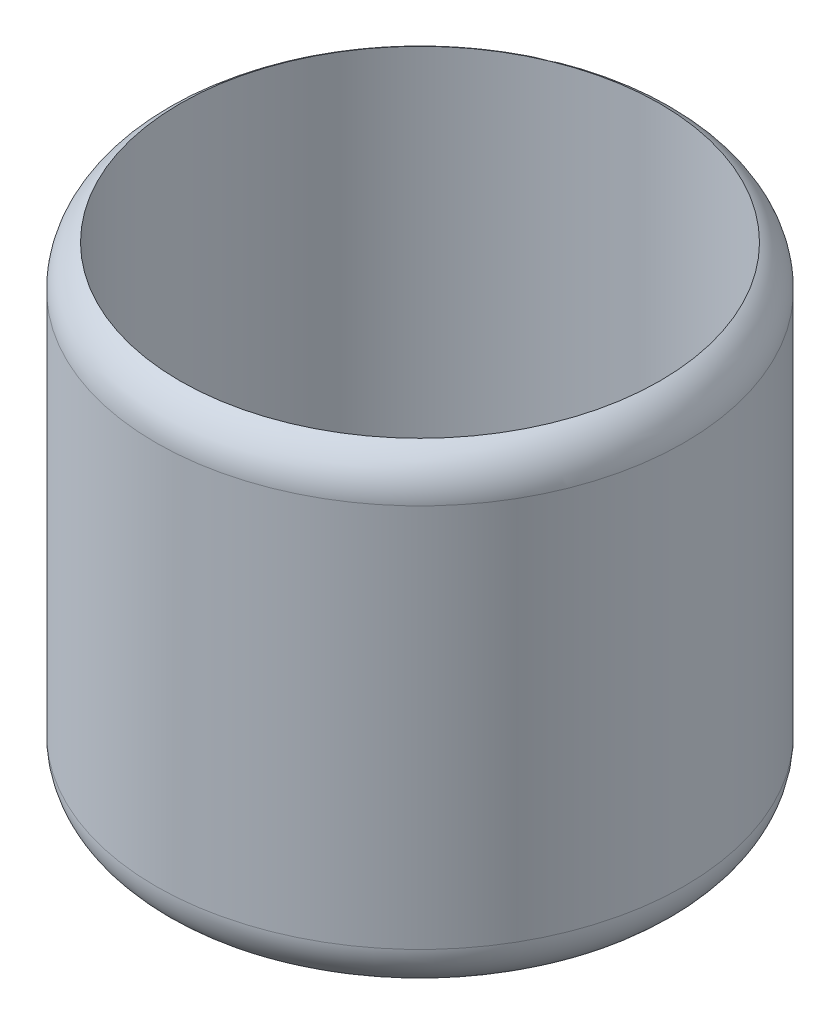
ISO-10303-21;
HEADER;
FILE_DESCRIPTION(('STEP AP214'),'2;1');
FILE_NAME('part.step','',(''),(''),'','','');
FILE_SCHEMA(('AUTOMOTIVE_DESIGN { 1 0 10303 214 1 1 1 1 }'));
ENDSEC;
DATA;
#1=APPLICATION_CONTEXT('core data for automotive mechanical design processes');
#2=APPLICATION_PROTOCOL_DEFINITION('international standard','automotive_design',2000,#1);
#3=PRODUCT_CONTEXT('',#1,'mechanical');
#4=PRODUCT('Part','Part','',(#3));
#5=PRODUCT_RELATED_PRODUCT_CATEGORY('part','',(#4));
#6=PRODUCT_DEFINITION_FORMATION('','',#4);
#7=PRODUCT_DEFINITION_CONTEXT('part definition',#1,'design');
#8=PRODUCT_DEFINITION('design','',#6,#7);
#9=PRODUCT_DEFINITION_SHAPE('','',#8);
#10=(LENGTH_UNIT() NAMED_UNIT(*) SI_UNIT(.MILLI.,.METRE.));
#11=(NAMED_UNIT(*) PLANE_ANGLE_UNIT() SI_UNIT($,.RADIAN.));
#12=(NAMED_UNIT(*) SI_UNIT($,.STERADIAN.) SOLID_ANGLE_UNIT());
#13=UNCERTAINTY_MEASURE_WITH_UNIT(LENGTH_MEASURE(1.E-05),#10,'distance_accuracy_value','');
#14=(GEOMETRIC_REPRESENTATION_CONTEXT(3) GLOBAL_UNCERTAINTY_ASSIGNED_CONTEXT((#13)) GLOBAL_UNIT_ASSIGNED_CONTEXT((#10,
#11,#12)) REPRESENTATION_CONTEXT('',''));
#15=CARTESIAN_POINT('',(0.,0.,0.));
#16=DIRECTION('',(0.,0.,1.));
#17=DIRECTION('',(1.,0.,0.));
#18=AXIS2_PLACEMENT_3D('',#15,#16,#17);
#19=CARTESIAN_POINT('',(0.,100.,0.));
#20=DIRECTION('',(0.,-1.,0.));
#21=DIRECTION('',(0.,0.,-1.));
#22=AXIS2_PLACEMENT_3D('',#19,#20,#21);
#23=CYLINDRICAL_SURFACE('',#22,55.);
#24=CARTESIAN_POINT('',(0.,9.99999999999999,0.));
#25=DIRECTION('',(0.,1.,0.));
#26=DIRECTION('',(0.,0.,1.));
#27=AXIS2_PLACEMENT_3D('',#24,#25,#26);
#28=CIRCLE('',#27,55.);
#29=CARTESIAN_POINT('',(0.,9.99999999999999,55.));
#30=VERTEX_POINT('',#29);
#31=EDGE_CURVE('E42',#30,#30,#28,.T.);
#32=ORIENTED_EDGE('',*,*,#31,.T.);
#33=EDGE_LOOP('',(#32));
#34=FACE_BOUND('',#33,.T.);
#35=CARTESIAN_POINT('',(0.,90.,0.));
#36=DIRECTION('',(0.,1.,0.));
#37=DIRECTION('',(0.,0.,1.));
#38=AXIS2_PLACEMENT_3D('',#35,#36,#37);
#39=CIRCLE('',#38,55.);
#40=CARTESIAN_POINT('',(0.,90.,55.));
#41=VERTEX_POINT('',#40);
#42=EDGE_CURVE('E46',#41,#41,#39,.F.);
#43=ORIENTED_EDGE('',*,*,#42,.T.);
#44=EDGE_LOOP('',(#43));
#45=FACE_BOUND('',#44,.T.);
#46=ADVANCED_FACE('F34',(#34,#45),#23,.T.);
#47=CARTESIAN_POINT('',(0.,0.,0.));
#48=DIRECTION('',(0.,1.,0.));
#49=DIRECTION('',(0.,0.,1.));
#50=AXIS2_PLACEMENT_3D('',#47,#48,#49);
#51=PLANE('',#50);
#52=CARTESIAN_POINT('',(0.,0.,0.));
#53=DIRECTION('',(0.,1.,0.));
#54=DIRECTION('',(0.,0.,1.));
#55=AXIS2_PLACEMENT_3D('',#52,#53,#54);
#56=CIRCLE('',#55,45.);
#57=CARTESIAN_POINT('',(0.,0.,45.));
#58=VERTEX_POINT('',#57);
#59=EDGE_CURVE('E10',#58,#58,#56,.F.);
#60=ORIENTED_EDGE('',*,*,#59,.T.);
#61=EDGE_LOOP('',(#60));
#62=FACE_BOUND('',#61,.T.);
#63=ADVANCED_FACE('F67',(#62),#51,.F.);
#64=CARTESIAN_POINT('',(0.,9.99999999999999,0.));
#65=DIRECTION('',(0.,1.,0.));
#66=DIRECTION('',(0.,0.,1.));
#67=AXIS2_PLACEMENT_3D('',#64,#65,#66);
#68=TOROIDAL_SURFACE('',#67,45.,10.);
#69=ORIENTED_EDGE('',*,*,#59,.F.);
#70=EDGE_LOOP('',(#69));
#71=FACE_BOUND('',#70,.T.);
#72=ORIENTED_EDGE('',*,*,#31,.F.);
#73=EDGE_LOOP('',(#72));
#74=FACE_BOUND('',#73,.T.);
#75=ADVANCED_FACE('F63',(#71,#74),#68,.T.);
#76=CARTESIAN_POINT('',(0.,90.,0.));
#77=DIRECTION('',(0.,1.,0.));
#78=DIRECTION('',(0.,0.,1.));
#79=AXIS2_PLACEMENT_3D('',#76,#77,#78);
#80=TOROIDAL_SURFACE('',#79,45.,10.);
#81=CARTESIAN_POINT('',(0.,98.6602540378444,0.));
#82=DIRECTION('',(0.,-1.,0.));
#83=DIRECTION('',(0.,0.,-1.));
#84=AXIS2_PLACEMENT_3D('',#81,#82,#83);
#85=CIRCLE('',#84,50.);
#86=CARTESIAN_POINT('',(0.,98.6602540378444,50.));
#87=VERTEX_POINT('',#86);
#88=EDGE_CURVE('E38',#87,#87,#85,.F.);
#89=ORIENTED_EDGE('',*,*,#88,.F.);
#90=EDGE_LOOP('',(#89));
#91=FACE_BOUND('',#90,.T.);
#92=ORIENTED_EDGE('',*,*,#42,.F.);
#93=EDGE_LOOP('',(#92));
#94=FACE_BOUND('',#93,.T.);
#95=ADVANCED_FACE('F36',(#91,#94),#80,.T.);
#96=CARTESIAN_POINT('',(0.,10.,0.));
#97=DIRECTION('',(0.,1.,0.));
#98=DIRECTION('',(0.,0.,1.));
#99=AXIS2_PLACEMENT_3D('',#96,#97,#98);
#100=CYLINDRICAL_SURFACE('',#99,50.);
#101=CARTESIAN_POINT('',(0.,10.,0.));
#102=DIRECTION('',(0.,1.,0.));
#103=DIRECTION('',(0.,0.,1.));
#104=AXIS2_PLACEMENT_3D('',#101,#102,#103);
#105=CIRCLE('',#104,50.);
#106=CARTESIAN_POINT('',(0.,10.,50.));
#107=VERTEX_POINT('',#106);
#108=EDGE_CURVE('E51',#107,#107,#105,.T.);
#109=CARTESIAN_POINT('',(0.,98.6602540378444,50.));
#110=CARTESIAN_POINT('',(0.,97.7367097249502,50.));
#111=CARTESIAN_POINT('',(0.,96.813165412056,50.));
#112=CARTESIAN_POINT('',(0.,94.9660767862676,50.));
#113=CARTESIAN_POINT('',(0.,94.0425324733733,50.));
#114=CARTESIAN_POINT('',(0.,92.1954438475849,50.));
#115=CARTESIAN_POINT('',(0.,91.2718995346907,50.));
#116=CARTESIAN_POINT('',(0.,89.4248109089023,50.));
#117=CARTESIAN_POINT('',(0.,88.5012665960081,50.));
#118=CARTESIAN_POINT('',(0.,86.6541779702196,50.));
#119=CARTESIAN_POINT('',(0.,85.7306336573254,50.));
#120=CARTESIAN_POINT('',(0.,83.883545031537,50.));
#121=CARTESIAN_POINT('',(0.,82.9600007186428,50.));
#122=CARTESIAN_POINT('',(0.,81.1129120928544,50.));
#123=CARTESIAN_POINT('',(0.,80.1893677799602,50.));
#124=CARTESIAN_POINT('',(0.,78.3422791541717,50.));
#125=CARTESIAN_POINT('',(0.,77.4187348412775,50.));
#126=CARTESIAN_POINT('',(0.,75.5716462154891,50.));
#127=CARTESIAN_POINT('',(0.,74.6481019025949,50.));
#128=CARTESIAN_POINT('',(0.,72.8010132768065,50.));
#129=CARTESIAN_POINT('',(0.,71.8774689639122,50.));
#130=CARTESIAN_POINT('',(0.,70.0303803381238,50.));
#131=CARTESIAN_POINT('',(0.,69.1068360252296,50.));
#132=CARTESIAN_POINT('',(0.,67.2597473994412,50.));
#133=CARTESIAN_POINT('',(0.,66.336203086547,50.));
#134=CARTESIAN_POINT('',(0.,64.4891144607586,50.));
#135=CARTESIAN_POINT('',(0.,63.5655701478643,50.));
#136=CARTESIAN_POINT('',(0.,61.7184815220759,50.));
#137=CARTESIAN_POINT('',(0.,60.7949372091817,50.));
#138=CARTESIAN_POINT('',(0.,58.9478485833933,50.));
#139=CARTESIAN_POINT('',(0.,58.0243042704991,50.));
#140=CARTESIAN_POINT('',(0.,56.1772156447106,50.));
#141=CARTESIAN_POINT('',(0.,55.2536713318164,50.));
#142=CARTESIAN_POINT('',(0.,53.406582706028,50.));
#143=CARTESIAN_POINT('',(0.,52.4830383931338,50.));
#144=CARTESIAN_POINT('',(0.,50.6359497673454,50.));
#145=CARTESIAN_POINT('',(0.,49.7124054544511,50.));
#146=CARTESIAN_POINT('',(0.,47.8653168286627,50.));
#147=CARTESIAN_POINT('',(0.,46.9417725157685,50.));
#148=CARTESIAN_POINT('',(0.,45.0946838899801,50.));
#149=CARTESIAN_POINT('',(0.,44.1711395770859,50.));
#150=CARTESIAN_POINT('',(0.,42.3240509512975,50.));
#151=CARTESIAN_POINT('',(0.,41.4005066384032,50.));
#152=CARTESIAN_POINT('',(0.,39.5534180126148,50.));
#153=CARTESIAN_POINT('',(0.,38.6298736997206,50.));
#154=CARTESIAN_POINT('',(0.,36.7827850739322,50.));
#155=CARTESIAN_POINT('',(0.,35.859240761038,50.));
#156=CARTESIAN_POINT('',(0.,34.0121521352495,50.));
#157=CARTESIAN_POINT('',(0.,33.0886078223553,50.));
#158=CARTESIAN_POINT('',(0.,31.2415191965669,50.));
#159=CARTESIAN_POINT('',(0.,30.3179748836727,50.));
#160=CARTESIAN_POINT('',(0.,28.4708862578843,50.));
#161=CARTESIAN_POINT('',(0.,27.54734194499,50.));
#162=CARTESIAN_POINT('',(0.,25.7002533192016,50.));
#163=CARTESIAN_POINT('',(0.,24.7767090063074,50.));
#164=CARTESIAN_POINT('',(0.,22.929620380519,50.));
#165=CARTESIAN_POINT('',(0.,22.0060760676248,50.));
#166=CARTESIAN_POINT('',(0.,20.1589874418363,50.));
#167=CARTESIAN_POINT('',(0.,19.2354431289421,50.));
#168=CARTESIAN_POINT('',(0.,17.3883545031537,50.));
#169=CARTESIAN_POINT('',(0.,16.4648101902595,50.));
#170=CARTESIAN_POINT('',(0.,14.6177215644711,50.));
#171=CARTESIAN_POINT('',(0.,13.6941772515769,50.));
#172=CARTESIAN_POINT('',(0.,11.8470886257884,50.));
#173=CARTESIAN_POINT('',(0.,10.9235443128942,50.));
#174=CARTESIAN_POINT('',(0.,10.,50.));
#175=B_SPLINE_CURVE_WITH_KNOTS('',3,(#109,#110,#111,#112,#113,#114,#115,#116,#117,#118,#119,
#120,#121,#122,#123,#124,#125,#126,#127,#128,#129,#130,#131,#132,#133,#134,#135,#136,#137,#138,
#139,#140,#141,#142,#143,#144,#145,#146,#147,#148,#149,#150,#151,#152,#153,#154,#155,#156,#157,
#158,#159,#160,#161,#162,#163,#164,#165,#166,#167,#168,#169,#170,#171,#172,#173,#174),
.UNSPECIFIED.,.F.,.F.,(4,2,2,2,2,2,2,2,2,2,2,2,2,2,2,2,2,2,2,2,2,2,2,2,2,2,2,2,2,2,2,2,4),(0.,
2.77063293868264,5.54126587736528,8.31189881604791,11.0825317547305,13.8531646934132,
16.6237976320958,19.3944305707785,22.1650635094611,24.9356964481437,27.7063293868264,
30.476962325509,33.2475952641916,36.0182282028743,38.7888611415569,41.5594940802396,
44.3301270189222,47.1007599576048,49.8713928962875,52.6420258349701,55.4126587736528,
58.1832917123354,60.953924651018,63.7245575897007,66.4951905283833,69.2658234670659,
72.0364564057486,74.8070893444312,77.5777222831139,80.3483552217965,83.1189881604791,
85.8896210991618,88.6602540378444),.UNSPECIFIED.);
#176=EDGE_CURVE('BSEAM58',#87,#107,#175,.T.);
#177=ORIENTED_EDGE('',*,*,#88,.T.);
#178=ORIENTED_EDGE('',*,*,#108,.F.);
#179=ORIENTED_EDGE('',*,*,#176,.T.);
#180=ORIENTED_EDGE('',*,*,#176,.F.);
#181=EDGE_LOOP('',(#177,#179,#178,#180));
#182=FACE_BOUND('',#181,.T.);
#183=ADVANCED_FACE('F58',(#182),#100,.F.);
#184=CARTESIAN_POINT('',(0.,10.,0.));
#185=DIRECTION('',(0.,1.,0.));
#186=DIRECTION('',(0.,0.,1.));
#187=AXIS2_PLACEMENT_3D('',#184,#185,#186);
#188=PLANE('',#187);
#189=ORIENTED_EDGE('',*,*,#108,.T.);
#190=EDGE_LOOP('',(#189));
#191=FACE_BOUND('',#190,.T.);
#192=ADVANCED_FACE('F93',(#191),#188,.T.);
#193=CLOSED_SHELL('',(#46,#63,#75,#95,#183,#192));
#194=MANIFOLD_SOLID_BREP('B2',#193);
#195=ADVANCED_BREP_SHAPE_REPRESENTATION('',(#18,#194),#14);
#196=SHAPE_DEFINITION_REPRESENTATION(#9,#195);
ENDSEC;
END-ISO-10303-21;
